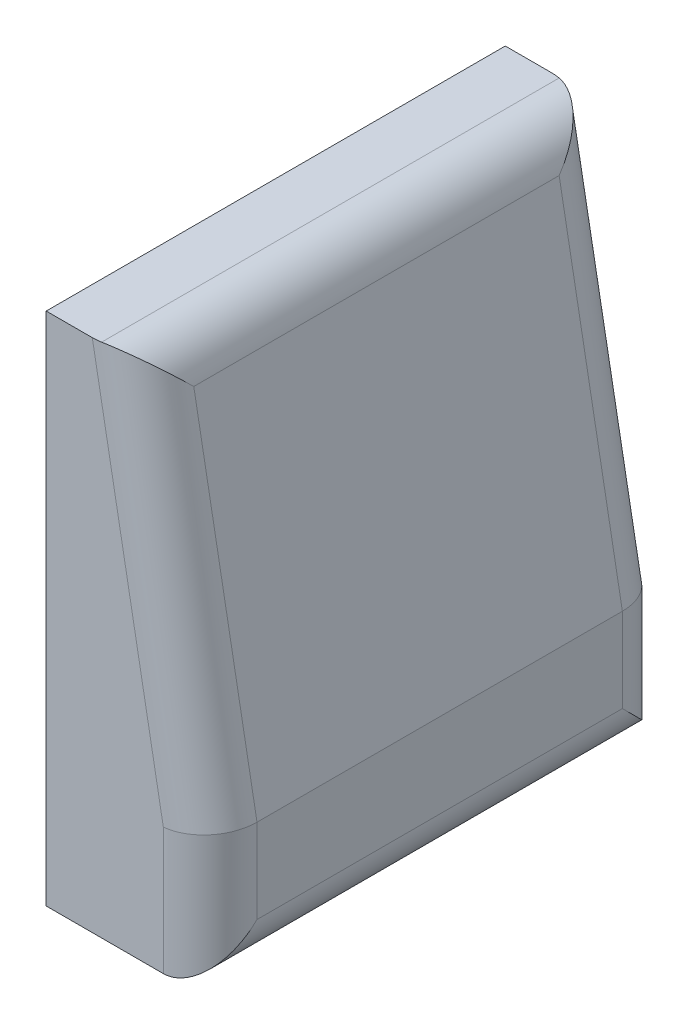
ISO-10303-21;
HEADER;
FILE_DESCRIPTION(('STEP AP214'),'2;1');
FILE_NAME('part.step','',(''),(''),'','','');
FILE_SCHEMA(('AUTOMOTIVE_DESIGN { 1 0 10303 214 1 1 1 1 }'));
ENDSEC;
DATA;
#1=APPLICATION_CONTEXT('core data for automotive mechanical design processes');
#2=APPLICATION_PROTOCOL_DEFINITION('international standard','automotive_design',2000,#1);
#3=PRODUCT_CONTEXT('',#1,'mechanical');
#4=PRODUCT('Part','Part','',(#3));
#5=PRODUCT_RELATED_PRODUCT_CATEGORY('part','',(#4));
#6=PRODUCT_DEFINITION_FORMATION('','',#4);
#7=PRODUCT_DEFINITION_CONTEXT('part definition',#1,'design');
#8=PRODUCT_DEFINITION('design','',#6,#7);
#9=PRODUCT_DEFINITION_SHAPE('','',#8);
#10=(LENGTH_UNIT() NAMED_UNIT(*) SI_UNIT(.MILLI.,.METRE.));
#11=(NAMED_UNIT(*) PLANE_ANGLE_UNIT() SI_UNIT($,.RADIAN.));
#12=(NAMED_UNIT(*) SI_UNIT($,.STERADIAN.) SOLID_ANGLE_UNIT());
#13=UNCERTAINTY_MEASURE_WITH_UNIT(LENGTH_MEASURE(1.E-05),#10,'distance_accuracy_value','');
#14=(GEOMETRIC_REPRESENTATION_CONTEXT(3) GLOBAL_UNCERTAINTY_ASSIGNED_CONTEXT((#13)) GLOBAL_UNIT_ASSIGNED_CONTEXT((#10,
#11,#12)) REPRESENTATION_CONTEXT('',''));
#15=CARTESIAN_POINT('',(0.,0.,0.));
#16=DIRECTION('',(0.,0.,1.));
#17=DIRECTION('',(1.,0.,0.));
#18=AXIS2_PLACEMENT_3D('',#15,#16,#17);
#19=CARTESIAN_POINT('',(-175.,657.894736842105,490.));
#20=DIRECTION('',(1.,0.,0.));
#21=DIRECTION('',(0.,1.,0.));
#22=AXIS2_PLACEMENT_3D('',#19,#20,#21);
#23=PLANE('',#22);
#24=DIRECTION('',(0.,-1.,0.));
#25=VECTOR('',#24,1.);
#26=CARTESIAN_POINT('',(-175.,657.894736842105,-490.));
#27=LINE('',#26,#25);
#28=CARTESIAN_POINT('',(-175.,657.894736842105,-490.));
#29=VERTEX_POINT('',#28);
#30=CARTESIAN_POINT('',(-175.,-442.105263157895,-490.));
#31=VERTEX_POINT('',#30);
#32=EDGE_CURVE('E128',#29,#31,#27,.T.);
#33=ORIENTED_EDGE('',*,*,#32,.T.);
#34=DIRECTION('',(0.,0.,-1.));
#35=VECTOR('',#34,1.);
#36=CARTESIAN_POINT('',(-175.,-442.105263157895,490.));
#37=LINE('',#36,#35);
#38=CARTESIAN_POINT('',(-175.,-442.105263157895,490.));
#39=VERTEX_POINT('',#38);
#40=EDGE_CURVE('E111',#39,#31,#37,.T.);
#41=ORIENTED_EDGE('',*,*,#40,.F.);
#42=DIRECTION('',(0.,-1.,0.));
#43=VECTOR('',#42,1.);
#44=CARTESIAN_POINT('',(-175.,657.894736842105,490.));
#45=LINE('',#44,#43);
#46=CARTESIAN_POINT('',(-175.,657.894736842105,490.));
#47=VERTEX_POINT('',#46);
#48=EDGE_CURVE('E117',#47,#39,#45,.T.);
#49=ORIENTED_EDGE('',*,*,#48,.F.);
#50=DIRECTION('',(0.,0.,-1.));
#51=VECTOR('',#50,1.);
#52=CARTESIAN_POINT('',(-175.,657.894736842105,490.));
#53=LINE('',#52,#51);
#54=EDGE_CURVE('E135',#47,#29,#53,.T.);
#55=ORIENTED_EDGE('',*,*,#54,.T.);
#56=EDGE_LOOP('',(#33,#41,#49,#55));
#57=FACE_BOUND('',#56,.T.);
#58=ADVANCED_FACE('F37',(#57),#23,.F.);
#59=CARTESIAN_POINT('',(-175.,-442.105263157895,490.));
#60=DIRECTION('',(0.,1.,0.));
#61=DIRECTION('',(0.,0.,1.));
#62=AXIS2_PLACEMENT_3D('',#59,#60,#61);
#63=PLANE('',#62);
#64=DIRECTION('',(1.,0.,0.));
#65=VECTOR('',#64,1.);
#66=CARTESIAN_POINT('',(-175.,-442.105263157895,-490.));
#67=LINE('',#66,#65);
#68=CARTESIAN_POINT('',(75.,-442.105263157895,-490.));
#69=VERTEX_POINT('',#68);
#70=EDGE_CURVE('E180',#31,#69,#67,.T.);
#71=ORIENTED_EDGE('',*,*,#70,.T.);
#72=DIRECTION('',(0.,0.,-1.));
#73=VECTOR('',#72,1.);
#74=CARTESIAN_POINT('',(75.,-442.105263157895,490.));
#75=LINE('',#74,#73);
#76=CARTESIAN_POINT('',(75.,-442.105263157895,490.));
#77=VERTEX_POINT('',#76);
#78=EDGE_CURVE('E11',#69,#77,#75,.F.);
#79=ORIENTED_EDGE('',*,*,#78,.T.);
#80=DIRECTION('',(1.,0.,0.));
#81=VECTOR('',#80,1.);
#82=CARTESIAN_POINT('',(-175.,-442.105263157895,490.));
#83=LINE('',#82,#81);
#84=EDGE_CURVE('E107',#39,#77,#83,.T.);
#85=ORIENTED_EDGE('',*,*,#84,.F.);
#86=ORIENTED_EDGE('',*,*,#40,.T.);
#87=EDGE_LOOP('',(#71,#79,#85,#86));
#88=FACE_BOUND('',#87,.T.);
#89=ADVANCED_FACE('F109',(#88),#63,.F.);
#90=CARTESIAN_POINT('',(175.,-442.105263157895,490.));
#91=DIRECTION('',(-1.,0.,0.));
#92=DIRECTION('',(0.,0.,1.));
#93=AXIS2_PLACEMENT_3D('',#90,#91,#92);
#94=PLANE('',#93);
#95=DIRECTION('',(0.,0.,-1.));
#96=VECTOR('',#95,1.);
#97=CARTESIAN_POINT('',(175.,-162.105263157895,490.));
#98=LINE('',#97,#96);
#99=CARTESIAN_POINT('',(175.,-162.105263157895,390.));
#100=VERTEX_POINT('',#99);
#101=CARTESIAN_POINT('',(175.,-162.105263157895,-390.));
#102=VERTEX_POINT('',#101);
#103=EDGE_CURVE('E130',#100,#102,#98,.T.);
#104=ORIENTED_EDGE('',*,*,#103,.F.);
#105=DIRECTION('',(0.,1.,0.));
#106=VECTOR('',#105,1.);
#107=CARTESIAN_POINT('',(175.,-442.105263157895,390.));
#108=LINE('',#107,#106);
#109=CARTESIAN_POINT('',(175.,-342.105263157895,390.));
#110=VERTEX_POINT('',#109);
#111=EDGE_CURVE('E158',#100,#110,#108,.F.);
#112=ORIENTED_EDGE('',*,*,#111,.T.);
#113=DIRECTION('',(0.,0.,-1.));
#114=VECTOR('',#113,1.);
#115=CARTESIAN_POINT('',(175.,-342.105263157895,490.));
#116=LINE('',#115,#114);
#117=CARTESIAN_POINT('',(175.,-342.105263157895,-390.));
#118=VERTEX_POINT('',#117);
#119=EDGE_CURVE('E154',#110,#118,#116,.T.);
#120=ORIENTED_EDGE('',*,*,#119,.T.);
#121=DIRECTION('',(0.,1.,0.));
#122=VECTOR('',#121,1.);
#123=CARTESIAN_POINT('',(175.,-442.105263157895,-390.));
#124=LINE('',#123,#122);
#125=EDGE_CURVE('E156',#118,#102,#124,.T.);
#126=ORIENTED_EDGE('',*,*,#125,.T.);
#127=EDGE_LOOP('',(#104,#112,#120,#126));
#128=FACE_BOUND('',#127,.T.);
#129=ADVANCED_FACE('F211',(#128),#94,.F.);
#130=CARTESIAN_POINT('',(175.,-162.105263157895,490.));
#131=DIRECTION('',(-0.983677406707226,-0.17994098903181,0.));
#132=DIRECTION('',(0.17994098903181,-0.983677406707227,0.));
#133=AXIS2_PLACEMENT_3D('',#130,#131,#132);
#134=PLANE('',#133);
#135=ORIENTED_EDGE('',*,*,#103,.T.);
#136=DIRECTION('',(-0.17994098903181,0.983677406707227,0.));
#137=VECTOR('',#136,1.);
#138=CARTESIAN_POINT('',(175.,-162.105263157895,-390.));
#139=LINE('',#138,#137);
#140=CARTESIAN_POINT('',(40.0010794689302,575.888835745286,-390.));
#141=VERTEX_POINT('',#140);
#142=EDGE_CURVE('E148',#102,#141,#139,.T.);
#143=ORIENTED_EDGE('',*,*,#142,.T.);
#144=DIRECTION('',(0.,0.,-1.));
#145=VECTOR('',#144,1.);
#146=CARTESIAN_POINT('',(40.0010794689302,575.888835745286,490.));
#147=LINE('',#146,#145);
#148=CARTESIAN_POINT('',(40.0010794689302,575.888835745286,390.));
#149=VERTEX_POINT('',#148);
#150=EDGE_CURVE('E145',#141,#149,#147,.F.);
#151=ORIENTED_EDGE('',*,*,#150,.T.);
#152=DIRECTION('',(-0.17994098903181,0.983677406707227,0.));
#153=VECTOR('',#152,1.);
#154=CARTESIAN_POINT('',(175.,-162.105263157895,390.));
#155=LINE('',#154,#153);
#156=EDGE_CURVE('E143',#149,#100,#155,.F.);
#157=ORIENTED_EDGE('',*,*,#156,.T.);
#158=EDGE_LOOP('',(#135,#143,#151,#157));
#159=FACE_BOUND('',#158,.T.);
#160=ADVANCED_FACE('F213',(#159),#134,.F.);
#161=CARTESIAN_POINT('',(-175.,657.894736842105,490.));
#162=DIRECTION('',(0.,-1.,0.));
#163=DIRECTION('',(0.,0.,-1.));
#164=AXIS2_PLACEMENT_3D('',#161,#162,#163);
#165=PLANE('',#164);
#166=DIRECTION('',(0.,0.,-1.));
#167=VECTOR('',#166,1.);
#168=CARTESIAN_POINT('',(-58.3666612017924,657.894736842105,490.));
#169=LINE('',#168,#167);
#170=CARTESIAN_POINT('',(-58.3666612017924,657.894736842105,488.367740670723));
#171=VERTEX_POINT('',#170);
#172=CARTESIAN_POINT('',(-58.3666612017924,657.894736842105,-488.367740670723));
#173=VERTEX_POINT('',#172);
#174=EDGE_CURVE('E132',#171,#173,#169,.T.);
#175=ORIENTED_EDGE('',*,*,#174,.T.);
#176=CARTESIAN_POINT('',(-76.6593441286217,657.894736842105,-390.));
#177=DIRECTION('',(0.,-1.,0.));
#178=DIRECTION('',(-1.,0.,0.));
#179=AXIS2_PLACEMENT_3D('',#176,#177,#178);
#180=ELLIPSE('',#179,101.659344128622,100.);
#181=CARTESIAN_POINT('',(-76.6593441286217,657.894736842105,-490.));
#182=VERTEX_POINT('',#181);
#183=EDGE_CURVE('E141',#173,#182,#180,.F.);
#184=ORIENTED_EDGE('',*,*,#183,.T.);
#185=DIRECTION('',(-1.,0.,0.));
#186=VECTOR('',#185,1.);
#187=CARTESIAN_POINT('',(-175.,657.894736842105,-490.));
#188=LINE('',#187,#186);
#189=EDGE_CURVE('E125',#182,#29,#188,.T.);
#190=ORIENTED_EDGE('',*,*,#189,.T.);
#191=ORIENTED_EDGE('',*,*,#54,.F.);
#192=DIRECTION('',(-1.,0.,0.));
#193=VECTOR('',#192,1.);
#194=CARTESIAN_POINT('',(-175.,657.894736842105,490.));
#195=LINE('',#194,#193);
#196=CARTESIAN_POINT('',(-76.6593441286217,657.894736842105,490.));
#197=VERTEX_POINT('',#196);
#198=EDGE_CURVE('E116',#197,#47,#195,.T.);
#199=ORIENTED_EDGE('',*,*,#198,.F.);
#200=CARTESIAN_POINT('',(-76.6593441286217,657.894736842105,390.));
#201=DIRECTION('',(0.,-1.,0.));
#202=DIRECTION('',(1.,0.,0.));
#203=AXIS2_PLACEMENT_3D('',#200,#201,#202);
#204=ELLIPSE('',#203,101.659344128622,100.);
#205=EDGE_CURVE('E129',#197,#171,#204,.F.);
#206=ORIENTED_EDGE('',*,*,#205,.T.);
#207=EDGE_LOOP('',(#175,#184,#190,#191,#199,#206));
#208=FACE_BOUND('',#207,.T.);
#209=ADVANCED_FACE('F194',(#208),#165,.F.);
#210=CARTESIAN_POINT('',(0.,0.,490.));
#211=DIRECTION('',(0.,0.,1.));
#212=DIRECTION('',(1.,0.,0.));
#213=AXIS2_PLACEMENT_3D('',#210,#211,#212);
#214=PLANE('',#213);
#215=ORIENTED_EDGE('',*,*,#84,.T.);
#216=DIRECTION('',(0.,1.,0.));
#217=VECTOR('',#216,1.);
#218=CARTESIAN_POINT('',(75.,-162.105263157895,490.));
#219=LINE('',#218,#217);
#220=CARTESIAN_POINT('',(75.,-171.17634439436,490.));
#221=VERTEX_POINT('',#220);
#222=EDGE_CURVE('E152',#77,#221,#219,.T.);
#223=ORIENTED_EDGE('',*,*,#222,.T.);
#224=DIRECTION('',(-0.17994098903181,0.983677406707227,0.));
#225=VECTOR('',#224,1.);
#226=CARTESIAN_POINT('',(-73.3677406707228,639.900637938925,490.));
#227=LINE('',#226,#225);
#228=EDGE_CURVE('E150',#221,#197,#227,.T.);
#229=ORIENTED_EDGE('',*,*,#228,.T.);
#230=ORIENTED_EDGE('',*,*,#198,.T.);
#231=ORIENTED_EDGE('',*,*,#48,.T.);
#232=EDGE_LOOP('',(#215,#223,#229,#230,#231));
#233=FACE_BOUND('',#232,.T.);
#234=ADVANCED_FACE('F120',(#233),#214,.T.);
#235=CARTESIAN_POINT('',(0.,0.,-490.));
#236=DIRECTION('',(0.,0.,1.));
#237=DIRECTION('',(1.,0.,0.));
#238=AXIS2_PLACEMENT_3D('',#235,#236,#237);
#239=PLANE('',#238);
#240=ORIENTED_EDGE('',*,*,#189,.F.);
#241=DIRECTION('',(-0.17994098903181,0.983677406707227,0.));
#242=VECTOR('',#241,1.);
#243=CARTESIAN_POINT('',(42.2727149798443,7.73281371582517,-490.));
#244=LINE('',#243,#242);
#245=CARTESIAN_POINT('',(75.,-171.17634439436,-490.));
#246=VERTEX_POINT('',#245);
#247=EDGE_CURVE('E46',#182,#246,#244,.F.);
#248=ORIENTED_EDGE('',*,*,#247,.T.);
#249=DIRECTION('',(0.,1.,0.));
#250=VECTOR('',#249,1.);
#251=CARTESIAN_POINT('',(75.,0.,-490.));
#252=LINE('',#251,#250);
#253=EDGE_CURVE('E57',#246,#69,#252,.F.);
#254=ORIENTED_EDGE('',*,*,#253,.T.);
#255=ORIENTED_EDGE('',*,*,#70,.F.);
#256=ORIENTED_EDGE('',*,*,#32,.F.);
#257=EDGE_LOOP('',(#240,#248,#254,#255,#256));
#258=FACE_BOUND('',#257,.T.);
#259=ADVANCED_FACE('F186',(#258),#239,.F.);
#260=CARTESIAN_POINT('',(75.,-342.105263157895,490.));
#261=DIRECTION('',(0.,0.,-1.));
#262=DIRECTION('',(-1.,0.,0.));
#263=AXIS2_PLACEMENT_3D('',#260,#261,#262);
#264=CYLINDRICAL_SURFACE('',#263,100.);
#265=CARTESIAN_POINT('',(75.,-342.105263157895,-390.));
#266=DIRECTION('',(0.,0.707106781186547,-0.707106781186547));
#267=DIRECTION('',(0.,-0.707106781186547,-0.707106781186547));
#268=AXIS2_PLACEMENT_3D('',#265,#266,#267);
#269=ELLIPSE('',#268,141.421356237309,100.);
#270=EDGE_CURVE('E171',#118,#69,#269,.T.);
#271=ORIENTED_EDGE('',*,*,#270,.F.);
#272=ORIENTED_EDGE('',*,*,#119,.F.);
#273=CARTESIAN_POINT('',(75.,-342.105263157895,390.));
#274=DIRECTION('',(0.,-0.707106781186547,-0.707106781186547));
#275=DIRECTION('',(0.,0.707106781186547,-0.707106781186547));
#276=AXIS2_PLACEMENT_3D('',#273,#274,#275);
#277=ELLIPSE('',#276,141.421356237309,100.);
#278=EDGE_CURVE('E41',#77,#110,#277,.F.);
#279=ORIENTED_EDGE('',*,*,#278,.F.);
#280=ORIENTED_EDGE('',*,*,#78,.F.);
#281=EDGE_LOOP('',(#271,#272,#279,#280));
#282=FACE_BOUND('',#281,.T.);
#283=ADVANCED_FACE('F39',(#282),#264,.T.);
#284=CARTESIAN_POINT('',(75.,0.,390.));
#285=DIRECTION('',(0.,-1.,0.));
#286=DIRECTION('',(0.,0.,-1.));
#287=AXIS2_PLACEMENT_3D('',#284,#285,#286);
#288=CYLINDRICAL_SURFACE('',#287,100.);
#289=ORIENTED_EDGE('',*,*,#278,.T.);
#290=ORIENTED_EDGE('',*,*,#111,.F.);
#291=CARTESIAN_POINT('',(75.,-171.17634439436,390.));
#292=DIRECTION('',(0.0903398950983827,-0.995910991682295,0.));
#293=DIRECTION('',(0.995910991682295,0.0903398950983817,0.));
#294=AXIS2_PLACEMENT_3D('',#291,#292,#293);
#295=ELLIPSE('',#294,100.410579695561,100.);
#296=EDGE_CURVE('E169',#221,#100,#295,.F.);
#297=ORIENTED_EDGE('',*,*,#296,.F.);
#298=ORIENTED_EDGE('',*,*,#222,.F.);
#299=EDGE_LOOP('',(#289,#290,#297,#298));
#300=FACE_BOUND('',#299,.T.);
#301=ADVANCED_FACE('F190',(#300),#288,.T.);
#302=CARTESIAN_POINT('',(75.,-442.105263157895,-390.));
#303=DIRECTION('',(0.,1.,0.));
#304=DIRECTION('',(0.,0.,1.));
#305=AXIS2_PLACEMENT_3D('',#302,#303,#304);
#306=CYLINDRICAL_SURFACE('',#305,100.);
#307=ORIENTED_EDGE('',*,*,#270,.T.);
#308=ORIENTED_EDGE('',*,*,#253,.F.);
#309=CARTESIAN_POINT('',(75.0000000000003,-171.176344394363,-390.));
#310=DIRECTION('',(-0.0903398950983827,0.995910991682295,0.));
#311=DIRECTION('',(0.995910991682295,0.0903398950983817,0.));
#312=AXIS2_PLACEMENT_3D('',#309,#310,#311);
#313=ELLIPSE('',#312,100.410579695561,100.);
#314=EDGE_CURVE('E166',#102,#246,#313,.T.);
#315=ORIENTED_EDGE('',*,*,#314,.F.);
#316=ORIENTED_EDGE('',*,*,#125,.F.);
#317=EDGE_LOOP('',(#307,#308,#315,#316));
#318=FACE_BOUND('',#317,.T.);
#319=ADVANCED_FACE('F208',(#318),#306,.T.);
#320=CARTESIAN_POINT('',(42.2727149798442,7.73281371582517,390.));
#321=DIRECTION('',(0.17994098903181,-0.983677406707227,0.));
#322=DIRECTION('',(0.983677406707227,0.17994098903181,0.));
#323=AXIS2_PLACEMENT_3D('',#320,#321,#322);
#324=CYLINDRICAL_SURFACE('',#323,100.);
#325=ORIENTED_EDGE('',*,*,#296,.T.);
#326=ORIENTED_EDGE('',*,*,#156,.F.);
#327=CARTESIAN_POINT('',(-58.3666612017925,557.894736842105,390.));
#328=DIRECTION('',(0.127237493557807,-0.695564964782677,0.707106781186547));
#329=DIRECTION('',(0.127237493557807,-0.695564964782677,-0.707106781186547));
#330=AXIS2_PLACEMENT_3D('',#327,#328,#329);
#331=ELLIPSE('',#330,141.421356237309,100.);
#332=EDGE_CURVE('E164',#171,#149,#331,.F.);
#333=ORIENTED_EDGE('',*,*,#332,.F.);
#334=ORIENTED_EDGE('',*,*,#205,.F.);
#335=ORIENTED_EDGE('',*,*,#228,.F.);
#336=EDGE_LOOP('',(#325,#326,#333,#334,#335));
#337=FACE_BOUND('',#336,.T.);
#338=ADVANCED_FACE('F196',(#337),#324,.T.);
#339=CARTESIAN_POINT('',(76.6322593292774,-180.099362061076,-390.));
#340=DIRECTION('',(-0.17994098903181,0.983677406707227,0.));
#341=DIRECTION('',(-0.983677406707227,-0.17994098903181,0.));
#342=AXIS2_PLACEMENT_3D('',#339,#340,#341);
#343=CYLINDRICAL_SURFACE('',#342,100.);
#344=ORIENTED_EDGE('',*,*,#247,.F.);
#345=ORIENTED_EDGE('',*,*,#183,.F.);
#346=CARTESIAN_POINT('',(-58.3666612017924,557.894736842105,-390.));
#347=DIRECTION('',(-0.127237493557807,0.695564964782677,0.707106781186547));
#348=DIRECTION('',(-0.127237493557807,0.695564964782677,-0.707106781186547));
#349=AXIS2_PLACEMENT_3D('',#346,#347,#348);
#350=ELLIPSE('',#349,141.421356237309,100.);
#351=EDGE_CURVE('E162',#141,#173,#350,.T.);
#352=ORIENTED_EDGE('',*,*,#351,.F.);
#353=ORIENTED_EDGE('',*,*,#142,.F.);
#354=ORIENTED_EDGE('',*,*,#314,.T.);
#355=EDGE_LOOP('',(#344,#345,#352,#353,#354));
#356=FACE_BOUND('',#355,.T.);
#357=ADVANCED_FACE('F205',(#356),#343,.T.);
#358=CARTESIAN_POINT('',(-58.3666612017924,557.894736842105,490.));
#359=DIRECTION('',(0.,0.,-1.));
#360=DIRECTION('',(-1.,0.,0.));
#361=AXIS2_PLACEMENT_3D('',#358,#359,#360);
#362=CYLINDRICAL_SURFACE('',#361,100.);
#363=ORIENTED_EDGE('',*,*,#332,.T.);
#364=ORIENTED_EDGE('',*,*,#150,.F.);
#365=ORIENTED_EDGE('',*,*,#351,.T.);
#366=ORIENTED_EDGE('',*,*,#174,.F.);
#367=EDGE_LOOP('',(#363,#364,#365,#366));
#368=FACE_BOUND('',#367,.T.);
#369=ADVANCED_FACE('F201',(#368),#362,.T.);
#370=CLOSED_SHELL('',(#58,#89,#129,#160,#209,#234,#259,#283,#301,#319,#338,#357,#369));
#371=MANIFOLD_SOLID_BREP('B2',#370);
#372=ADVANCED_BREP_SHAPE_REPRESENTATION('',(#18,#371),#14);
#373=SHAPE_DEFINITION_REPRESENTATION(#9,#372);
ENDSEC;
END-ISO-10303-21;
